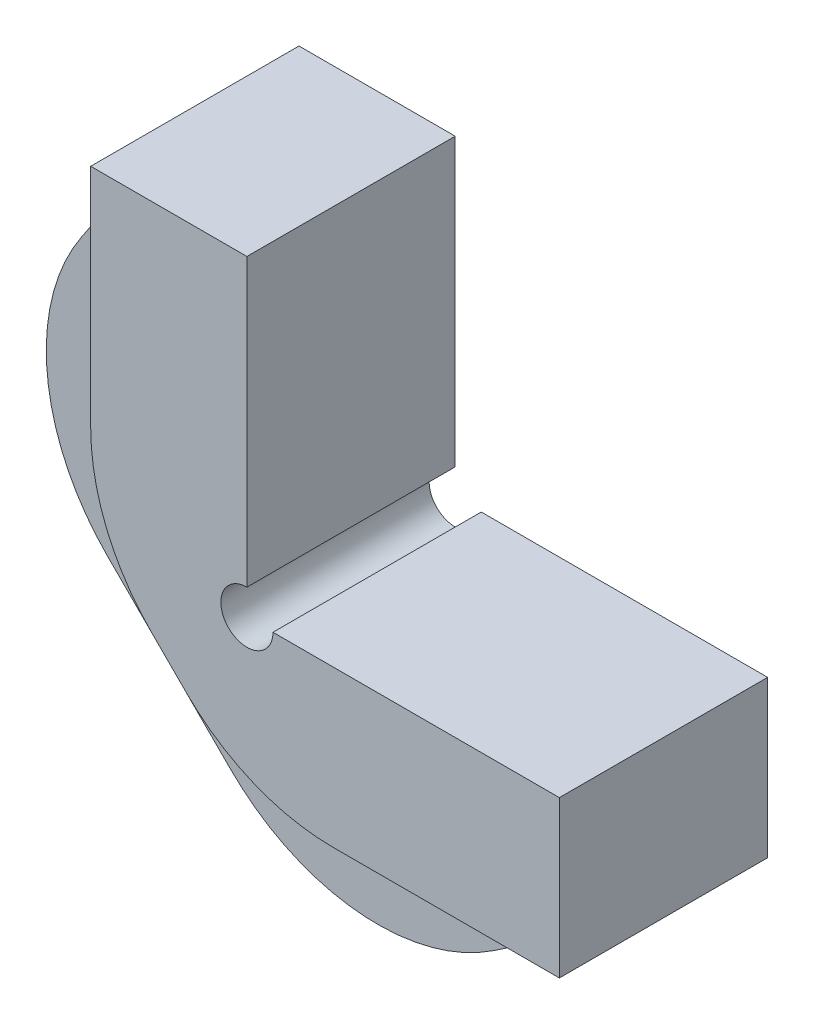
ISO-10303-21;
HEADER;
FILE_DESCRIPTION(('STEP AP214'),'2;1');
FILE_NAME('part.step','',(''),(''),'','','');
FILE_SCHEMA(('AUTOMOTIVE_DESIGN { 1 0 10303 214 1 1 1 1 }'));
ENDSEC;
DATA;
#1=APPLICATION_CONTEXT('core data for automotive mechanical design processes');
#2=APPLICATION_PROTOCOL_DEFINITION('international standard','automotive_design',2000,#1);
#3=PRODUCT_CONTEXT('',#1,'mechanical');
#4=PRODUCT('Part','Part','',(#3));
#5=PRODUCT_RELATED_PRODUCT_CATEGORY('part','',(#4));
#6=PRODUCT_DEFINITION_FORMATION('','',#4);
#7=PRODUCT_DEFINITION_CONTEXT('part definition',#1,'design');
#8=PRODUCT_DEFINITION('design','',#6,#7);
#9=PRODUCT_DEFINITION_SHAPE('','',#8);
#10=(LENGTH_UNIT() NAMED_UNIT(*) SI_UNIT(.MILLI.,.METRE.));
#11=(NAMED_UNIT(*) PLANE_ANGLE_UNIT() SI_UNIT($,.RADIAN.));
#12=(NAMED_UNIT(*) SI_UNIT($,.STERADIAN.) SOLID_ANGLE_UNIT());
#13=UNCERTAINTY_MEASURE_WITH_UNIT(LENGTH_MEASURE(1.E-05),#10,'distance_accuracy_value','');
#14=(GEOMETRIC_REPRESENTATION_CONTEXT(3) GLOBAL_UNCERTAINTY_ASSIGNED_CONTEXT((#13)) GLOBAL_UNIT_ASSIGNED_CONTEXT((#10,
#11,#12)) REPRESENTATION_CONTEXT('',''));
#15=CARTESIAN_POINT('',(0.,0.,0.));
#16=DIRECTION('',(0.,0.,1.));
#17=DIRECTION('',(1.,0.,0.));
#18=AXIS2_PLACEMENT_3D('',#15,#16,#17);
#19=CARTESIAN_POINT('',(-15.,30.,20.));
#20=DIRECTION('',(1.,0.,0.));
#21=DIRECTION('',(0.,0.,-1.));
#22=AXIS2_PLACEMENT_3D('',#19,#20,#21);
#23=PLANE('',#22);
#24=DIRECTION('',(0.,1.,0.));
#25=VECTOR('',#24,1.);
#26=CARTESIAN_POINT('',(-15.,0.,10.));
#27=LINE('',#26,#25);
#28=CARTESIAN_POINT('',(-15.,8.2842712474619,10.));
#29=VERTEX_POINT('',#28);
#30=CARTESIAN_POINT('',(-15.,30.,10.));
#31=VERTEX_POINT('',#30);
#32=EDGE_CURVE('E294',#29,#31,#27,.T.);
#33=ORIENTED_EDGE('',*,*,#32,.F.);
#34=DIRECTION('',(0.,0.,-1.));
#35=VECTOR('',#34,1.);
#36=CARTESIAN_POINT('',(-15.,8.2842712474619,20.));
#37=LINE('',#36,#35);
#38=CARTESIAN_POINT('',(-15.,8.2842712474619,20.));
#39=VERTEX_POINT('',#38);
#40=EDGE_CURVE('E256',#29,#39,#37,.F.);
#41=ORIENTED_EDGE('',*,*,#40,.T.);
#42=DIRECTION('',(0.,-1.,0.));
#43=VECTOR('',#42,1.);
#44=CARTESIAN_POINT('',(-15.,30.,20.));
#45=LINE('',#44,#43);
#46=CARTESIAN_POINT('',(-15.,30.,20.));
#47=VERTEX_POINT('',#46);
#48=EDGE_CURVE('E216',#47,#39,#45,.T.);
#49=ORIENTED_EDGE('',*,*,#48,.F.);
#50=DIRECTION('',(0.,0.,-1.));
#51=VECTOR('',#50,1.);
#52=CARTESIAN_POINT('',(-15.,30.,20.));
#53=LINE('',#52,#51);
#54=EDGE_CURVE('E199',#47,#31,#53,.T.);
#55=ORIENTED_EDGE('',*,*,#54,.T.);
#56=EDGE_LOOP('',(#33,#41,#49,#55));
#57=FACE_BOUND('',#56,.T.);
#58=ADVANCED_FACE('F43',(#57),#23,.F.);
#59=CARTESIAN_POINT('',(-15.,0.,20.));
#60=DIRECTION('',(0.707106781186548,0.707106781186548,0.));
#61=DIRECTION('',(-0.707106781186548,0.707106781186548,0.));
#62=AXIS2_PLACEMENT_3D('',#59,#60,#61);
#63=PLANE('',#62);
#64=DIRECTION('',(-0.707106781186548,0.707106781186548,0.));
#65=VECTOR('',#64,1.);
#66=CARTESIAN_POINT('',(-7.5,-7.5,10.));
#67=LINE('',#66,#65);
#68=CARTESIAN_POINT('',(-5.85786437626905,-9.14213562373095,10.));
#69=VERTEX_POINT('',#68);
#70=CARTESIAN_POINT('',(-9.14213562373095,-5.85786437626905,10.));
#71=VERTEX_POINT('',#70);
#72=EDGE_CURVE('E286',#69,#71,#67,.T.);
#73=ORIENTED_EDGE('',*,*,#72,.F.);
#74=DIRECTION('',(0.,0.,-1.));
#75=VECTOR('',#74,1.);
#76=CARTESIAN_POINT('',(-5.85786437626905,-9.14213562373095,20.));
#77=LINE('',#76,#75);
#78=CARTESIAN_POINT('',(-5.85786437626905,-9.14213562373095,20.));
#79=VERTEX_POINT('',#78);
#80=EDGE_CURVE('E248',#69,#79,#77,.F.);
#81=ORIENTED_EDGE('',*,*,#80,.T.);
#82=DIRECTION('',(0.707106781186547,-0.707106781186547,0.));
#83=VECTOR('',#82,1.);
#84=CARTESIAN_POINT('',(-15.,0.,20.));
#85=LINE('',#84,#83);
#86=CARTESIAN_POINT('',(-9.14213562373095,-5.85786437626905,20.));
#87=VERTEX_POINT('',#86);
#88=EDGE_CURVE('E165',#87,#79,#85,.T.);
#89=ORIENTED_EDGE('',*,*,#88,.F.);
#90=DIRECTION('',(0.,0.,-1.));
#91=VECTOR('',#90,1.);
#92=CARTESIAN_POINT('',(-9.14213562373095,-5.85786437626905,20.));
#93=LINE('',#92,#91);
#94=EDGE_CURVE('E244',#87,#71,#93,.T.);
#95=ORIENTED_EDGE('',*,*,#94,.T.);
#96=EDGE_LOOP('',(#73,#81,#89,#95));
#97=FACE_BOUND('',#96,.T.);
#98=ADVANCED_FACE('F290',(#97),#63,.F.);
#99=CARTESIAN_POINT('',(0.,-15.,20.));
#100=DIRECTION('',(0.,1.,0.));
#101=DIRECTION('',(0.,0.,1.));
#102=AXIS2_PLACEMENT_3D('',#99,#100,#101);
#103=PLANE('',#102);
#104=DIRECTION('',(1.,0.,0.));
#105=VECTOR('',#104,1.);
#106=CARTESIAN_POINT('',(0.,-15.,20.));
#107=LINE('',#106,#105);
#108=CARTESIAN_POINT('',(8.2842712474619,-15.,20.));
#109=VERTEX_POINT('',#108);
#110=CARTESIAN_POINT('',(30.,-15.,20.));
#111=VERTEX_POINT('',#110);
#112=EDGE_CURVE('E152',#109,#111,#107,.T.);
#113=ORIENTED_EDGE('',*,*,#112,.F.);
#114=DIRECTION('',(0.,0.,-1.));
#115=VECTOR('',#114,1.);
#116=CARTESIAN_POINT('',(8.2842712474619,-15.,20.));
#117=LINE('',#116,#115);
#118=CARTESIAN_POINT('',(8.2842712474619,-15.,10.));
#119=VERTEX_POINT('',#118);
#120=EDGE_CURVE('E241',#109,#119,#117,.T.);
#121=ORIENTED_EDGE('',*,*,#120,.T.);
#122=DIRECTION('',(-1.,0.,0.));
#123=VECTOR('',#122,1.);
#124=CARTESIAN_POINT('',(0.,-15.,10.));
#125=LINE('',#124,#123);
#126=CARTESIAN_POINT('',(30.,-15.,10.));
#127=VERTEX_POINT('',#126);
#128=EDGE_CURVE('E172',#127,#119,#125,.T.);
#129=ORIENTED_EDGE('',*,*,#128,.F.);
#130=DIRECTION('',(0.,0.,-1.));
#131=VECTOR('',#130,1.);
#132=CARTESIAN_POINT('',(30.,-15.,20.));
#133=LINE('',#132,#131);
#134=EDGE_CURVE('E169',#111,#127,#133,.T.);
#135=ORIENTED_EDGE('',*,*,#134,.F.);
#136=EDGE_LOOP('',(#113,#121,#129,#135));
#137=FACE_BOUND('',#136,.T.);
#138=ADVANCED_FACE('F170',(#137),#103,.F.);
#139=CARTESIAN_POINT('',(30.,0.,20.));
#140=DIRECTION('',(-1.,0.,0.));
#141=DIRECTION('',(0.,-1.,0.));
#142=AXIS2_PLACEMENT_3D('',#139,#140,#141);
#143=PLANE('',#142);
#144=DIRECTION('',(0.,1.,0.));
#145=VECTOR('',#144,1.);
#146=CARTESIAN_POINT('',(30.,0.,0.));
#147=LINE('',#146,#145);
#148=CARTESIAN_POINT('',(30.,-15.,0.));
#149=VERTEX_POINT('',#148);
#150=CARTESIAN_POINT('',(30.,0.,0.));
#151=VERTEX_POINT('',#150);
#152=EDGE_CURVE('E200',#149,#151,#147,.T.);
#153=ORIENTED_EDGE('',*,*,#152,.T.);
#154=DIRECTION('',(0.,0.,-1.));
#155=VECTOR('',#154,1.);
#156=CARTESIAN_POINT('',(30.,0.,20.));
#157=LINE('',#156,#155);
#158=CARTESIAN_POINT('',(30.,0.,20.));
#159=VERTEX_POINT('',#158);
#160=EDGE_CURVE('E178',#159,#151,#157,.T.);
#161=ORIENTED_EDGE('',*,*,#160,.F.);
#162=DIRECTION('',(0.,1.,0.));
#163=VECTOR('',#162,1.);
#164=CARTESIAN_POINT('',(30.,0.,20.));
#165=LINE('',#164,#163);
#166=EDGE_CURVE('E157',#111,#159,#165,.T.);
#167=ORIENTED_EDGE('',*,*,#166,.F.);
#168=ORIENTED_EDGE('',*,*,#134,.T.);
#169=DIRECTION('',(0.,0.,-1.));
#170=VECTOR('',#169,1.);
#171=CARTESIAN_POINT('',(30.,-15.,10.));
#172=LINE('',#171,#170);
#173=EDGE_CURVE('E392',#127,#149,#172,.T.);
#174=ORIENTED_EDGE('',*,*,#173,.T.);
#175=EDGE_LOOP('',(#153,#161,#167,#168,#174));
#176=FACE_BOUND('',#175,.T.);
#177=ADVANCED_FACE('F180',(#176),#143,.F.);
#178=CARTESIAN_POINT('',(2.5,0.,20.));
#179=DIRECTION('',(0.,-1.,0.));
#180=DIRECTION('',(0.,0.,-1.));
#181=AXIS2_PLACEMENT_3D('',#178,#179,#180);
#182=PLANE('',#181);
#183=DIRECTION('',(-1.,0.,0.));
#184=VECTOR('',#183,1.);
#185=CARTESIAN_POINT('',(2.5,0.,0.));
#186=LINE('',#185,#184);
#187=CARTESIAN_POINT('',(2.5,0.,0.));
#188=VERTEX_POINT('',#187);
#189=EDGE_CURVE('E203',#151,#188,#186,.T.);
#190=ORIENTED_EDGE('',*,*,#189,.T.);
#191=DIRECTION('',(0.,0.,-1.));
#192=VECTOR('',#191,1.);
#193=CARTESIAN_POINT('',(2.5,0.,20.));
#194=LINE('',#193,#192);
#195=CARTESIAN_POINT('',(2.5,0.,20.));
#196=VERTEX_POINT('',#195);
#197=EDGE_CURVE('E228',#196,#188,#194,.T.);
#198=ORIENTED_EDGE('',*,*,#197,.F.);
#199=DIRECTION('',(-1.,0.,0.));
#200=VECTOR('',#199,1.);
#201=CARTESIAN_POINT('',(2.5,0.,20.));
#202=LINE('',#201,#200);
#203=EDGE_CURVE('E184',#159,#196,#202,.T.);
#204=ORIENTED_EDGE('',*,*,#203,.F.);
#205=ORIENTED_EDGE('',*,*,#160,.T.);
#206=EDGE_LOOP('',(#190,#198,#204,#205));
#207=FACE_BOUND('',#206,.T.);
#208=ADVANCED_FACE('F327',(#207),#182,.F.);
#209=CARTESIAN_POINT('',(0.,0.,20.));
#210=DIRECTION('',(0.,0.,-1.));
#211=DIRECTION('',(-1.,0.,0.));
#212=AXIS2_PLACEMENT_3D('',#209,#210,#211);
#213=CYLINDRICAL_SURFACE('',#212,2.5);
#214=CARTESIAN_POINT('',(0.,0.,0.));
#215=DIRECTION('',(0.,0.,-1.));
#216=DIRECTION('',(1.,0.,0.));
#217=AXIS2_PLACEMENT_3D('',#214,#215,#216);
#218=CIRCLE('',#217,2.5);
#219=CARTESIAN_POINT('',(0.,2.5,0.));
#220=VERTEX_POINT('',#219);
#221=EDGE_CURVE('E207',#188,#220,#218,.T.);
#222=ORIENTED_EDGE('',*,*,#221,.T.);
#223=DIRECTION('',(0.,0.,-1.));
#224=VECTOR('',#223,1.);
#225=CARTESIAN_POINT('',(0.,2.5,20.));
#226=LINE('',#225,#224);
#227=CARTESIAN_POINT('',(0.,2.5,20.));
#228=VERTEX_POINT('',#227);
#229=EDGE_CURVE('E224',#228,#220,#226,.T.);
#230=ORIENTED_EDGE('',*,*,#229,.F.);
#231=CARTESIAN_POINT('',(0.,0.,20.));
#232=DIRECTION('',(0.,0.,-1.));
#233=DIRECTION('',(1.,0.,0.));
#234=AXIS2_PLACEMENT_3D('',#231,#232,#233);
#235=CIRCLE('',#234,2.5);
#236=EDGE_CURVE('E187',#196,#228,#235,.T.);
#237=ORIENTED_EDGE('',*,*,#236,.F.);
#238=ORIENTED_EDGE('',*,*,#197,.T.);
#239=EDGE_LOOP('',(#222,#230,#237,#238));
#240=FACE_BOUND('',#239,.T.);
#241=ADVANCED_FACE('F330',(#240),#213,.F.);
#242=CARTESIAN_POINT('',(0.,30.,20.));
#243=DIRECTION('',(-1.,0.,0.));
#244=DIRECTION('',(0.,-1.,0.));
#245=AXIS2_PLACEMENT_3D('',#242,#243,#244);
#246=PLANE('',#245);
#247=DIRECTION('',(0.,1.,0.));
#248=VECTOR('',#247,1.);
#249=CARTESIAN_POINT('',(0.,30.,0.));
#250=LINE('',#249,#248);
#251=CARTESIAN_POINT('',(0.,30.,0.));
#252=VERTEX_POINT('',#251);
#253=EDGE_CURVE('E210',#220,#252,#250,.T.);
#254=ORIENTED_EDGE('',*,*,#253,.T.);
#255=DIRECTION('',(0.,0.,-1.));
#256=VECTOR('',#255,1.);
#257=CARTESIAN_POINT('',(0.,30.,20.));
#258=LINE('',#257,#256);
#259=CARTESIAN_POINT('',(0.,30.,20.));
#260=VERTEX_POINT('',#259);
#261=EDGE_CURVE('E220',#260,#252,#258,.T.);
#262=ORIENTED_EDGE('',*,*,#261,.F.);
#263=DIRECTION('',(0.,1.,0.));
#264=VECTOR('',#263,1.);
#265=CARTESIAN_POINT('',(0.,30.,20.));
#266=LINE('',#265,#264);
#267=EDGE_CURVE('E193',#228,#260,#266,.T.);
#268=ORIENTED_EDGE('',*,*,#267,.F.);
#269=ORIENTED_EDGE('',*,*,#229,.T.);
#270=EDGE_LOOP('',(#254,#262,#268,#269));
#271=FACE_BOUND('',#270,.T.);
#272=ADVANCED_FACE('F334',(#271),#246,.F.);
#273=CARTESIAN_POINT('',(-15.,30.,20.));
#274=DIRECTION('',(0.,-1.,0.));
#275=DIRECTION('',(0.,0.,-1.));
#276=AXIS2_PLACEMENT_3D('',#273,#274,#275);
#277=PLANE('',#276);
#278=DIRECTION('',(-1.,0.,0.));
#279=VECTOR('',#278,1.);
#280=CARTESIAN_POINT('',(-15.,30.,0.));
#281=LINE('',#280,#279);
#282=CARTESIAN_POINT('',(-15.,30.,0.));
#283=VERTEX_POINT('',#282);
#284=EDGE_CURVE('E213',#252,#283,#281,.T.);
#285=ORIENTED_EDGE('',*,*,#284,.T.);
#286=DIRECTION('',(0.,0.,-1.));
#287=VECTOR('',#286,1.);
#288=CARTESIAN_POINT('',(-15.,30.,10.));
#289=LINE('',#288,#287);
#290=EDGE_CURVE('E204',#31,#283,#289,.T.);
#291=ORIENTED_EDGE('',*,*,#290,.F.);
#292=ORIENTED_EDGE('',*,*,#54,.F.);
#293=DIRECTION('',(-1.,0.,0.));
#294=VECTOR('',#293,1.);
#295=CARTESIAN_POINT('',(-15.,30.,20.));
#296=LINE('',#295,#294);
#297=EDGE_CURVE('E196',#260,#47,#296,.T.);
#298=ORIENTED_EDGE('',*,*,#297,.F.);
#299=ORIENTED_EDGE('',*,*,#261,.T.);
#300=EDGE_LOOP('',(#285,#291,#292,#298,#299));
#301=FACE_BOUND('',#300,.T.);
#302=ADVANCED_FACE('F338',(#301),#277,.F.);
#303=CARTESIAN_POINT('',(0.,0.,20.));
#304=DIRECTION('',(0.,0.,1.));
#305=DIRECTION('',(1.,0.,0.));
#306=AXIS2_PLACEMENT_3D('',#303,#304,#305);
#307=PLANE('',#306);
#308=ORIENTED_EDGE('',*,*,#88,.T.);
#309=CARTESIAN_POINT('',(8.2842712474619,5.,20.));
#310=DIRECTION('',(0.,0.,1.));
#311=DIRECTION('',(1.,0.,0.));
#312=AXIS2_PLACEMENT_3D('',#309,#310,#311);
#313=CIRCLE('',#312,20.);
#314=EDGE_CURVE('E160',#79,#109,#313,.T.);
#315=ORIENTED_EDGE('',*,*,#314,.T.);
#316=ORIENTED_EDGE('',*,*,#112,.T.);
#317=ORIENTED_EDGE('',*,*,#166,.T.);
#318=ORIENTED_EDGE('',*,*,#203,.T.);
#319=ORIENTED_EDGE('',*,*,#236,.T.);
#320=ORIENTED_EDGE('',*,*,#267,.T.);
#321=ORIENTED_EDGE('',*,*,#297,.T.);
#322=ORIENTED_EDGE('',*,*,#48,.T.);
#323=CARTESIAN_POINT('',(5.,8.2842712474619,20.));
#324=DIRECTION('',(0.,0.,1.));
#325=DIRECTION('',(1.,0.,0.));
#326=AXIS2_PLACEMENT_3D('',#323,#324,#325);
#327=CIRCLE('',#326,20.);
#328=EDGE_CURVE('E251',#39,#87,#327,.T.);
#329=ORIENTED_EDGE('',*,*,#328,.T.);
#330=EDGE_LOOP('',(#308,#315,#316,#317,#318,#319,#320,#321,#322,#329));
#331=FACE_BOUND('',#330,.T.);
#332=ADVANCED_FACE('F155',(#331),#307,.T.);
#333=CARTESIAN_POINT('',(0.,0.,0.));
#334=DIRECTION('',(0.,0.,1.));
#335=DIRECTION('',(1.,0.,0.));
#336=AXIS2_PLACEMENT_3D('',#333,#334,#335);
#337=PLANE('',#336);
#338=CARTESIAN_POINT('',(-12.5,-12.5,0.));
#339=DIRECTION('',(0.,0.,1.));
#340=DIRECTION('',(1.,0.,0.));
#341=AXIS2_PLACEMENT_3D('',#338,#339,#340);
#342=CIRCLE('',#341,3.);
#343=CARTESIAN_POINT('',(-9.5,-12.5,0.));
#344=VERTEX_POINT('',#343);
#345=EDGE_CURVE('E371',#344,#344,#342,.T.);
#346=ORIENTED_EDGE('',*,*,#345,.T.);
#347=EDGE_LOOP('',(#346));
#348=FACE_BOUND('',#347,.T.);
#349=DIRECTION('',(0.707106781186547,-0.707106781186548,0.));
#350=VECTOR('',#349,1.);
#351=CARTESIAN_POINT('',(-17.5,-17.5,0.));
#352=LINE('',#351,#350);
#353=CARTESIAN_POINT('',(-23.4062220228902,-11.5937779771098,0.));
#354=VERTEX_POINT('',#353);
#355=CARTESIAN_POINT('',(-11.5937779771098,-23.4062220228902,0.));
#356=VERTEX_POINT('',#355);
#357=EDGE_CURVE('E376',#354,#356,#352,.T.);
#358=ORIENTED_EDGE('',*,*,#357,.F.);
#359=CARTESIAN_POINT('',(-9.26408639915928,2.54835764662118,0.));
#360=DIRECTION('',(0.,0.,1.));
#361=DIRECTION('',(1.,0.,0.));
#362=AXIS2_PLACEMENT_3D('',#359,#360,#361);
#363=CIRCLE('',#362,20.);
#364=CARTESIAN_POINT('',(-25.9050922859162,13.6423615711258,0.));
#365=VERTEX_POINT('',#364);
#366=EDGE_CURVE('E269',#354,#365,#363,.F.);
#367=ORIENTED_EDGE('',*,*,#366,.T.);
#368=DIRECTION('',(-0.554700196225229,-0.832050294337844,0.));
#369=VECTOR('',#368,1.);
#370=CARTESIAN_POINT('',(-24.2307692307692,16.1538461538462,0.));
#371=LINE('',#370,#369);
#372=EDGE_CURVE('E380',#283,#365,#371,.T.);
#373=ORIENTED_EDGE('',*,*,#372,.F.);
#374=ORIENTED_EDGE('',*,*,#284,.F.);
#375=ORIENTED_EDGE('',*,*,#253,.F.);
#376=ORIENTED_EDGE('',*,*,#221,.F.);
#377=ORIENTED_EDGE('',*,*,#189,.F.);
#378=ORIENTED_EDGE('',*,*,#152,.F.);
#379=DIRECTION('',(0.832050294337844,0.554700196225229,0.));
#380=VECTOR('',#379,1.);
#381=CARTESIAN_POINT('',(16.1538461538462,-24.2307692307692,0.));
#382=LINE('',#381,#380);
#383=CARTESIAN_POINT('',(13.6423615711258,-25.9050922859162,0.));
#384=VERTEX_POINT('',#383);
#385=EDGE_CURVE('E373',#384,#149,#382,.T.);
#386=ORIENTED_EDGE('',*,*,#385,.F.);
#387=CARTESIAN_POINT('',(2.54835764662118,-9.26408639915928,0.));
#388=DIRECTION('',(0.,0.,1.));
#389=DIRECTION('',(1.,0.,0.));
#390=AXIS2_PLACEMENT_3D('',#387,#388,#389);
#391=CIRCLE('',#390,20.);
#392=EDGE_CURVE('E266',#384,#356,#391,.F.);
#393=ORIENTED_EDGE('',*,*,#392,.T.);
#394=EDGE_LOOP('',(#358,#367,#373,#374,#375,#376,#377,#378,#386,#393));
#395=FACE_BOUND('',#394,.T.);
#396=ADVANCED_FACE('F343',(#348,#395),#337,.F.);
#397=CARTESIAN_POINT('',(-24.2307692307692,16.1538461538462,10.));
#398=DIRECTION('',(0.832050294337844,-0.554700196225229,0.));
#399=DIRECTION('',(0.554700196225229,0.832050294337844,0.));
#400=AXIS2_PLACEMENT_3D('',#397,#398,#399);
#401=PLANE('',#400);
#402=ORIENTED_EDGE('',*,*,#372,.T.);
#403=DIRECTION('',(0.,0.,-1.));
#404=VECTOR('',#403,1.);
#405=CARTESIAN_POINT('',(-25.9050922859162,13.6423615711258,10.));
#406=LINE('',#405,#404);
#407=CARTESIAN_POINT('',(-25.9050922859162,13.6423615711258,10.));
#408=VERTEX_POINT('',#407);
#409=EDGE_CURVE('E67',#365,#408,#406,.F.);
#410=ORIENTED_EDGE('',*,*,#409,.T.);
#411=DIRECTION('',(-0.554700196225229,-0.832050294337844,0.));
#412=VECTOR('',#411,1.);
#413=CARTESIAN_POINT('',(-24.2307692307692,16.1538461538462,10.));
#414=LINE('',#413,#412);
#415=EDGE_CURVE('E390',#31,#408,#414,.T.);
#416=ORIENTED_EDGE('',*,*,#415,.F.);
#417=ORIENTED_EDGE('',*,*,#290,.T.);
#418=EDGE_LOOP('',(#402,#410,#416,#417));
#419=FACE_BOUND('',#418,.T.);
#420=ADVANCED_FACE('F346',(#419),#401,.F.);
#421=CARTESIAN_POINT('',(-17.5,-17.5,10.));
#422=DIRECTION('',(0.707106781186548,0.707106781186547,0.));
#423=DIRECTION('',(-0.707106781186547,0.707106781186548,0.));
#424=AXIS2_PLACEMENT_3D('',#421,#422,#423);
#425=PLANE('',#424);
#426=DIRECTION('',(0.707106781186547,-0.707106781186548,0.));
#427=VECTOR('',#426,1.);
#428=CARTESIAN_POINT('',(-17.5,-17.5,10.));
#429=LINE('',#428,#427);
#430=CARTESIAN_POINT('',(-23.4062220228902,-11.5937779771098,10.));
#431=VERTEX_POINT('',#430);
#432=CARTESIAN_POINT('',(-11.5937779771098,-23.4062220228902,10.));
#433=VERTEX_POINT('',#432);
#434=EDGE_CURVE('E387',#431,#433,#429,.T.);
#435=ORIENTED_EDGE('',*,*,#434,.F.);
#436=DIRECTION('',(0.,0.,-1.));
#437=VECTOR('',#436,1.);
#438=CARTESIAN_POINT('',(-23.4062220228902,-11.5937779771098,10.));
#439=LINE('',#438,#437);
#440=EDGE_CURVE('E262',#431,#354,#439,.T.);
#441=ORIENTED_EDGE('',*,*,#440,.T.);
#442=ORIENTED_EDGE('',*,*,#357,.T.);
#443=DIRECTION('',(0.,0.,-1.));
#444=VECTOR('',#443,1.);
#445=CARTESIAN_POINT('',(-11.5937779771098,-23.4062220228902,10.));
#446=LINE('',#445,#444);
#447=EDGE_CURVE('E259',#356,#433,#446,.F.);
#448=ORIENTED_EDGE('',*,*,#447,.T.);
#449=EDGE_LOOP('',(#435,#441,#442,#448));
#450=FACE_BOUND('',#449,.T.);
#451=ADVANCED_FACE('F353',(#450),#425,.F.);
#452=CARTESIAN_POINT('',(16.1538461538462,-24.2307692307692,10.));
#453=DIRECTION('',(-0.554700196225229,0.832050294337844,0.));
#454=DIRECTION('',(-0.832050294337844,-0.554700196225229,0.));
#455=AXIS2_PLACEMENT_3D('',#452,#453,#454);
#456=PLANE('',#455);
#457=DIRECTION('',(0.832050294337844,0.554700196225229,0.));
#458=VECTOR('',#457,1.);
#459=CARTESIAN_POINT('',(16.1538461538462,-24.2307692307692,10.));
#460=LINE('',#459,#458);
#461=CARTESIAN_POINT('',(13.6423615711258,-25.9050922859162,10.));
#462=VERTEX_POINT('',#461);
#463=EDGE_CURVE('E384',#462,#127,#460,.T.);
#464=ORIENTED_EDGE('',*,*,#463,.F.);
#465=DIRECTION('',(0.,0.,-1.));
#466=VECTOR('',#465,1.);
#467=CARTESIAN_POINT('',(13.6423615711258,-25.9050922859162,10.));
#468=LINE('',#467,#466);
#469=EDGE_CURVE('E279',#462,#384,#468,.T.);
#470=ORIENTED_EDGE('',*,*,#469,.T.);
#471=ORIENTED_EDGE('',*,*,#385,.T.);
#472=ORIENTED_EDGE('',*,*,#173,.F.);
#473=EDGE_LOOP('',(#464,#470,#471,#472));
#474=FACE_BOUND('',#473,.T.);
#475=ADVANCED_FACE('F350',(#474),#456,.F.);
#476=CARTESIAN_POINT('',(0.,0.,10.));
#477=DIRECTION('',(0.,0.,-1.));
#478=DIRECTION('',(-1.,0.,0.));
#479=AXIS2_PLACEMENT_3D('',#476,#477,#478);
#480=PLANE('',#479);
#481=CARTESIAN_POINT('',(-12.5,-12.5,10.));
#482=DIRECTION('',(0.,0.,-1.));
#483=DIRECTION('',(-1.,0.,0.));
#484=AXIS2_PLACEMENT_3D('',#481,#482,#483);
#485=CIRCLE('',#484,6.00000000000002);
#486=CARTESIAN_POINT('',(-18.5,-12.5,10.));
#487=VERTEX_POINT('',#486);
#488=EDGE_CURVE('E237',#487,#487,#485,.T.);
#489=ORIENTED_EDGE('',*,*,#488,.T.);
#490=EDGE_LOOP('',(#489));
#491=FACE_BOUND('',#490,.T.);
#492=ORIENTED_EDGE('',*,*,#415,.T.);
#493=CARTESIAN_POINT('',(-9.26408639915928,2.54835764662118,10.));
#494=DIRECTION('',(0.,0.,-1.));
#495=DIRECTION('',(-1.,0.,0.));
#496=AXIS2_PLACEMENT_3D('',#493,#494,#495);
#497=CIRCLE('',#496,20.);
#498=EDGE_CURVE('E276',#408,#431,#497,.F.);
#499=ORIENTED_EDGE('',*,*,#498,.T.);
#500=ORIENTED_EDGE('',*,*,#434,.T.);
#501=CARTESIAN_POINT('',(2.54835764662118,-9.26408639915928,10.));
#502=DIRECTION('',(0.,0.,-1.));
#503=DIRECTION('',(-1.,0.,0.));
#504=AXIS2_PLACEMENT_3D('',#501,#502,#503);
#505=CIRCLE('',#504,20.);
#506=EDGE_CURVE('E59',#433,#462,#505,.F.);
#507=ORIENTED_EDGE('',*,*,#506,.T.);
#508=ORIENTED_EDGE('',*,*,#463,.T.);
#509=ORIENTED_EDGE('',*,*,#128,.T.);
#510=CARTESIAN_POINT('',(8.2842712474619,5.,10.));
#511=DIRECTION('',(0.,0.,-1.));
#512=DIRECTION('',(-1.,0.,0.));
#513=AXIS2_PLACEMENT_3D('',#510,#511,#512);
#514=CIRCLE('',#513,20.);
#515=EDGE_CURVE('E52',#119,#69,#514,.T.);
#516=ORIENTED_EDGE('',*,*,#515,.T.);
#517=ORIENTED_EDGE('',*,*,#72,.T.);
#518=CARTESIAN_POINT('',(5.,8.2842712474619,10.));
#519=DIRECTION('',(0.,0.,-1.));
#520=DIRECTION('',(-1.,0.,0.));
#521=AXIS2_PLACEMENT_3D('',#518,#519,#520);
#522=CIRCLE('',#521,20.);
#523=EDGE_CURVE('E11',#71,#29,#522,.T.);
#524=ORIENTED_EDGE('',*,*,#523,.T.);
#525=ORIENTED_EDGE('',*,*,#32,.T.);
#526=EDGE_LOOP('',(#492,#499,#500,#507,#508,#509,#516,#517,#524,#525));
#527=FACE_BOUND('',#526,.T.);
#528=ADVANCED_FACE('F285',(#491,#527),#480,.F.);
#529=CARTESIAN_POINT('',(-12.5,-12.5,0.));
#530=DIRECTION('',(0.,0.,1.));
#531=DIRECTION('',(1.,0.,0.));
#532=AXIS2_PLACEMENT_3D('',#529,#530,#531);
#533=CYLINDRICAL_SURFACE('',#532,3.);
#534=CARTESIAN_POINT('',(-12.5,-12.5,6.99999999999998));
#535=DIRECTION('',(0.,0.,-1.));
#536=DIRECTION('',(-1.,0.,0.));
#537=AXIS2_PLACEMENT_3D('',#534,#535,#536);
#538=CIRCLE('',#537,3.);
#539=CARTESIAN_POINT('',(-15.5,-12.5,6.99999999999998));
#540=VERTEX_POINT('',#539);
#541=EDGE_CURVE('E177',#540,#540,#538,.F.);
#542=ORIENTED_EDGE('',*,*,#541,.T.);
#543=EDGE_LOOP('',(#542));
#544=FACE_BOUND('',#543,.T.);
#545=ORIENTED_EDGE('',*,*,#345,.F.);
#546=EDGE_LOOP('',(#545));
#547=FACE_BOUND('',#546,.T.);
#548=ADVANCED_FACE('F308',(#544,#547),#533,.F.);
#549=CARTESIAN_POINT('',(-12.5,-12.5,6.99999999999998));
#550=DIRECTION('',(0.,0.,1.));
#551=DIRECTION('',(1.,0.,0.));
#552=AXIS2_PLACEMENT_3D('',#549,#550,#551);
#553=CONICAL_SURFACE('',#552,3.,0.785398163397449);
#554=ORIENTED_EDGE('',*,*,#488,.F.);
#555=EDGE_LOOP('',(#554));
#556=FACE_BOUND('',#555,.T.);
#557=ORIENTED_EDGE('',*,*,#541,.F.);
#558=EDGE_LOOP('',(#557));
#559=FACE_BOUND('',#558,.T.);
#560=ADVANCED_FACE('F299',(#556,#559),#553,.F.);
#561=CARTESIAN_POINT('',(8.2842712474619,5.,20.));
#562=DIRECTION('',(0.,0.,-1.));
#563=DIRECTION('',(-1.,0.,0.));
#564=AXIS2_PLACEMENT_3D('',#561,#562,#563);
#565=CYLINDRICAL_SURFACE('',#564,20.);
#566=ORIENTED_EDGE('',*,*,#314,.F.);
#567=ORIENTED_EDGE('',*,*,#80,.F.);
#568=ORIENTED_EDGE('',*,*,#515,.F.);
#569=ORIENTED_EDGE('',*,*,#120,.F.);
#570=EDGE_LOOP('',(#566,#567,#568,#569));
#571=FACE_BOUND('',#570,.T.);
#572=ADVANCED_FACE('F296',(#571),#565,.T.);
#573=CARTESIAN_POINT('',(5.,8.2842712474619,20.));
#574=DIRECTION('',(0.,0.,-1.));
#575=DIRECTION('',(-1.,0.,0.));
#576=AXIS2_PLACEMENT_3D('',#573,#574,#575);
#577=CYLINDRICAL_SURFACE('',#576,20.);
#578=ORIENTED_EDGE('',*,*,#328,.F.);
#579=ORIENTED_EDGE('',*,*,#40,.F.);
#580=ORIENTED_EDGE('',*,*,#523,.F.);
#581=ORIENTED_EDGE('',*,*,#94,.F.);
#582=EDGE_LOOP('',(#578,#579,#580,#581));
#583=FACE_BOUND('',#582,.T.);
#584=ADVANCED_FACE('F298',(#583),#577,.T.);
#585=CARTESIAN_POINT('',(-9.26408639915928,2.54835764662118,10.));
#586=DIRECTION('',(0.,0.,-1.));
#587=DIRECTION('',(-1.,0.,0.));
#588=AXIS2_PLACEMENT_3D('',#585,#586,#587);
#589=CYLINDRICAL_SURFACE('',#588,20.);
#590=ORIENTED_EDGE('',*,*,#498,.F.);
#591=ORIENTED_EDGE('',*,*,#409,.F.);
#592=ORIENTED_EDGE('',*,*,#366,.F.);
#593=ORIENTED_EDGE('',*,*,#440,.F.);
#594=EDGE_LOOP('',(#590,#591,#592,#593));
#595=FACE_BOUND('',#594,.T.);
#596=ADVANCED_FACE('F305',(#595),#589,.T.);
#597=CARTESIAN_POINT('',(2.54835764662118,-9.26408639915928,10.));
#598=DIRECTION('',(0.,0.,-1.));
#599=DIRECTION('',(-1.,0.,0.));
#600=AXIS2_PLACEMENT_3D('',#597,#598,#599);
#601=CYLINDRICAL_SURFACE('',#600,20.);
#602=ORIENTED_EDGE('',*,*,#506,.F.);
#603=ORIENTED_EDGE('',*,*,#447,.F.);
#604=ORIENTED_EDGE('',*,*,#392,.F.);
#605=ORIENTED_EDGE('',*,*,#469,.F.);
#606=EDGE_LOOP('',(#602,#603,#604,#605));
#607=FACE_BOUND('',#606,.T.);
#608=ADVANCED_FACE('F45',(#607),#601,.T.);
#609=CLOSED_SHELL('',(#58,#98,#138,#177,#208,#241,#272,#302,#332,#396,#420,#451,#475,#528,#548,
#560,#572,#584,#596,#608));
#610=MANIFOLD_SOLID_BREP('B2',#609);
#611=ADVANCED_BREP_SHAPE_REPRESENTATION('',(#18,#610),#14);
#612=SHAPE_DEFINITION_REPRESENTATION(#9,#611);
ENDSEC;
END-ISO-10303-21;
